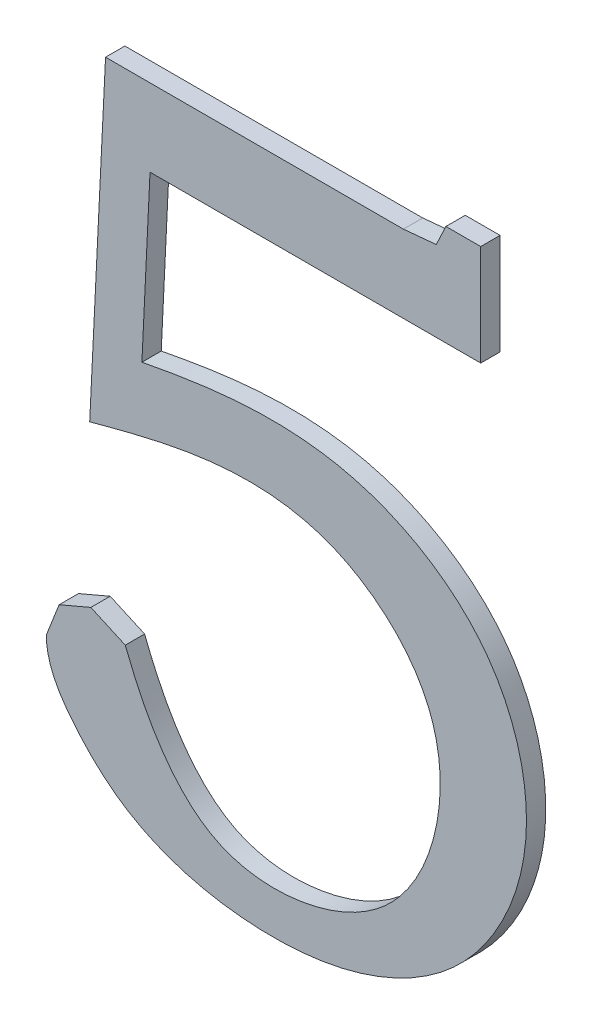
ISO-10303-21;
HEADER;
FILE_DESCRIPTION(('STEP AP214'),'2;1');
FILE_NAME('part.step','',(''),(''),'','','');
FILE_SCHEMA(('AUTOMOTIVE_DESIGN { 1 0 10303 214 1 1 1 1 }'));
ENDSEC;
DATA;
#1=APPLICATION_CONTEXT('core data for automotive mechanical design processes');
#2=APPLICATION_PROTOCOL_DEFINITION('international standard','automotive_design',2000,#1);
#3=PRODUCT_CONTEXT('',#1,'mechanical');
#4=PRODUCT('Part','Part','',(#3));
#5=PRODUCT_RELATED_PRODUCT_CATEGORY('part','',(#4));
#6=PRODUCT_DEFINITION_FORMATION('','',#4);
#7=PRODUCT_DEFINITION_CONTEXT('part definition',#1,'design');
#8=PRODUCT_DEFINITION('design','',#6,#7);
#9=PRODUCT_DEFINITION_SHAPE('','',#8);
#10=(LENGTH_UNIT() NAMED_UNIT(*) SI_UNIT(.MILLI.,.METRE.));
#11=(NAMED_UNIT(*) PLANE_ANGLE_UNIT() SI_UNIT($,.RADIAN.));
#12=(NAMED_UNIT(*) SI_UNIT($,.STERADIAN.) SOLID_ANGLE_UNIT());
#13=UNCERTAINTY_MEASURE_WITH_UNIT(LENGTH_MEASURE(1.E-05),#10,'distance_accuracy_value','');
#14=(GEOMETRIC_REPRESENTATION_CONTEXT(3) GLOBAL_UNCERTAINTY_ASSIGNED_CONTEXT((#13)) GLOBAL_UNIT_ASSIGNED_CONTEXT((#10,
#11,#12)) REPRESENTATION_CONTEXT('',''));
#15=CARTESIAN_POINT('',(0.,0.,0.));
#16=DIRECTION('',(0.,0.,1.));
#17=DIRECTION('',(1.,0.,0.));
#18=AXIS2_PLACEMENT_3D('',#15,#16,#17);
#19=CARTESIAN_POINT('',(0.,0.,0.05));
#20=DIRECTION('',(0.,0.,1.));
#21=DIRECTION('',(1.,0.,0.));
#22=AXIS2_PLACEMENT_3D('',#19,#20,#21);
#23=PLANE('',#22);
#24=CARTESIAN_POINT('',(0.215000000000006,-3.37500000000003,0.05));
#25=CARTESIAN_POINT('',(0.245903466585452,-3.36905711423566,0.05));
#26=CARTESIAN_POINT('',(0.276861083114359,-3.36342712276455,0.05));
#27=CARTESIAN_POINT('',(0.339083091608473,-3.3533354782567,0.05));
#28=CARTESIAN_POINT('',(0.370348202049942,-3.34887834210283,0.05));
#29=CARTESIAN_POINT('',(0.465470476616479,-3.33804916443584,0.05));
#30=CARTESIAN_POINT('',(0.529751407303073,-3.33442806677181,0.05));
#31=CARTESIAN_POINT('',(0.634715324383794,-3.33900187933727,0.05));
#32=CARTESIAN_POINT('',(0.675511591006974,-3.34339169712519,0.05));
#33=CARTESIAN_POINT('',(0.735689250542219,-3.3548825438947,0.05));
#34=CARTESIAN_POINT('',(0.755546621436471,-3.35951867413126,0.05));
#35=CARTESIAN_POINT('',(0.794779579926361,-3.3705221886248,0.05));
#36=CARTESIAN_POINT('',(0.814155156312189,-3.37688961312239,0.05));
#37=CARTESIAN_POINT('',(0.852467359147062,-3.39138186257519,0.05));
#38=CARTESIAN_POINT('',(0.871397467076891,-3.39952400005149,0.05));
#39=CARTESIAN_POINT('',(0.908432850529593,-3.41749609123042,0.05));
#40=CARTESIAN_POINT('',(0.926537950615481,-3.42732640182135,0.05));
#41=CARTESIAN_POINT('',(0.979317485429706,-3.45935943767655,0.05));
#42=CARTESIAN_POINT('',(1.0125199718965,-3.48412791484155,0.05));
#43=CARTESIAN_POINT('',(1.06383711617048,-3.53202986812759,0.05));
#44=CARTESIAN_POINT('',(1.08351556236493,-3.55349691589126,0.05));
#45=CARTESIAN_POINT('',(1.11877338084306,-3.59953766537733,0.05));
#46=CARTESIAN_POINT('',(1.13435983457692,-3.62410588970843,0.05));
#47=CARTESIAN_POINT('',(1.16116099954903,-3.67545159240918,0.05));
#48=CARTESIAN_POINT('',(1.17238163759565,-3.70222601545908,0.05));
#49=CARTESIAN_POINT('',(1.19048455769821,-3.75723968106191,0.05));
#50=CARTESIAN_POINT('',(1.19735935614138,-3.7854813602709,0.05));
#51=CARTESIAN_POINT('',(1.20691732778474,-3.84426334435704,0.05));
#52=CARTESIAN_POINT('',(1.20935222138211,-3.87484513124021,0.05));
#53=CARTESIAN_POINT('',(1.2092008571431,-3.92065927912881,0.05));
#54=CARTESIAN_POINT('',(1.20851688277896,-3.93591836571849,0.05));
#55=CARTESIAN_POINT('',(1.20585773827738,-3.96632366138515,0.05));
#56=CARTESIAN_POINT('',(1.20388260528059,-3.98146987369632,0.05));
#57=CARTESIAN_POINT('',(1.19602004152058,-4.02698791726087,0.05));
#58=CARTESIAN_POINT('',(1.18819771303669,-4.0570434459034,0.05));
#59=CARTESIAN_POINT('',(1.16790428540795,-4.11556737368617,0.05));
#60=CARTESIAN_POINT('',(1.15542541892041,-4.14403302911122,0.05));
#61=CARTESIAN_POINT('',(1.12541844922718,-4.20018817758872,0.05));
#62=CARTESIAN_POINT('',(1.10765230877395,-4.22775090461818,0.05));
#63=CARTESIAN_POINT('',(1.06782592688798,-4.27952756467753,0.05));
#64=CARTESIAN_POINT('',(1.04577292427871,-4.30374702688338,0.05));
#65=CARTESIAN_POINT('',(0.997645782698754,-4.34795149743017,0.05));
#66=CARTESIAN_POINT('',(0.971560186294016,-4.36792404283981,0.05));
#67=CARTESIAN_POINT('',(0.916466583641521,-4.4033301967737,0.05));
#68=CARTESIAN_POINT('',(0.887454813246492,-4.41875785629216,0.05));
#69=CARTESIAN_POINT('',(0.826896180832556,-4.44541857404922,0.05));
#70=CARTESIAN_POINT('',(0.795310566231487,-4.45656276795771,0.05));
#71=CARTESIAN_POINT('',(0.730921069599224,-4.47429890150065,0.05));
#72=CARTESIAN_POINT('',(0.698117667937941,-4.48089261643295,0.05));
#73=CARTESIAN_POINT('',(0.625564829208878,-4.49067059940833,0.05));
#74=CARTESIAN_POINT('',(0.585694208310927,-4.49295383712528,0.05));
#75=CARTESIAN_POINT('',(0.525915717618814,-4.4924108011374,0.05));
#76=CARTESIAN_POINT('',(0.505958273002295,-4.49156335758147,0.05));
#77=CARTESIAN_POINT('',(0.466144033970715,-4.48854671624867,0.05));
#78=CARTESIAN_POINT('',(0.446287221332685,-4.48637776707821,0.05));
#79=CARTESIAN_POINT('',(0.391645445935778,-4.47839643239916,0.05));
#80=CARTESIAN_POINT('',(0.357064848477889,-4.47106606377754,0.05));
#81=CARTESIAN_POINT('',(0.289561100597423,-4.4512342456699,0.05));
#82=CARTESIAN_POINT('',(0.256629385995813,-4.43876351442076,0.05));
#83=CARTESIAN_POINT('',(0.209182989478365,-4.41551997596485,0.05));
#84=CARTESIAN_POINT('',(0.193587485838812,-4.40693713391387,0.05));
#85=CARTESIAN_POINT('',(0.163405799646059,-4.38815929113625,0.05));
#86=CARTESIAN_POINT('',(0.148819073094776,-4.37796516921665,0.05));
#87=CARTESIAN_POINT('',(0.106711460343672,-4.34506143047575,0.05));
#88=CARTESIAN_POINT('',(0.0809480167147807,-4.32008141274925,0.05));
#89=CARTESIAN_POINT('',(0.0517702639148749,-4.28735015168786,0.05));
#90=CARTESIAN_POINT('',(0.0464288803680406,-4.28115151095174,0.05));
#91=CARTESIAN_POINT('',(0.0359612052448801,-4.2685761389865,0.05));
#92=CARTESIAN_POINT('',(0.0308348477583716,-4.26219946334206,0.05));
#93=CARTESIAN_POINT('',(0.0159536132241785,-4.2427198502194,0.05));
#94=CARTESIAN_POINT('',(0.00666776868684382,-4.22923648102013,0.05));
#95=CARTESIAN_POINT('',(-0.00743544372719811,-4.20472414513238,0.05));
#96=CARTESIAN_POINT('',(-0.0127832715877641,-4.1940071849183,0.05));
#97=CARTESIAN_POINT('',(-0.0217225935799708,-4.17188108609494,0.05));
#98=CARTESIAN_POINT('',(-0.0253209528200204,-4.160474853801,0.05));
#99=CARTESIAN_POINT('',(-0.0292292823414662,-4.14231449656517,0.05));
#100=CARTESIAN_POINT('',(-0.0302894160147364,-4.13571799643762,0.05));
#101=CARTESIAN_POINT('',(-0.0316949176221807,-4.12241561621906,0.05));
#102=CARTESIAN_POINT('',(-0.0320366078272705,-4.11570934958413,0.05));
#103=CARTESIAN_POINT('',(-0.0320000000000032,-4.109,0.05));
#104=B_SPLINE_CURVE_WITH_KNOTS('',3,(#24,#25,#26,#27,#28,#29,#30,#31,#32,#33,#34,#35,#36,#37,
#38,#39,#40,#41,#42,#43,#44,#45,#46,#47,#48,#49,#50,#51,#52,#53,#54,#55,#56,#57,#58,#59,#60,#61,
#62,#63,#64,#65,#66,#67,#68,#69,#70,#71,#72,#73,#74,#75,#76,#77,#78,#79,#80,#81,#82,#83,#84,#85,
#86,#87,#88,#89,#90,#91,#92,#93,#94,#95,#96,#97,#98,#99,#100,#101,#102,#103),.UNSPECIFIED.,.F.,
.F.,(4,2,2,2,2,2,2,2,2,2,2,2,2,2,2,2,2,2,2,2,2,2,2,2,2,2,2,2,2,2,2,2,2,2,2,2,2,2,2,4),(0.,
0.0943859908861195,0.189130328990095,0.38139247222954,0.504009278141294,0.565113466932535,
0.626219076094218,0.687949821319785,0.7496936328373,0.872980033116765,0.959960873291931,
1.04679018034974,1.133501197639,1.22036112896927,1.31194466120054,1.35772115704029,
1.40349633616052,1.49621874932082,1.58909652464235,1.68703410458372,1.78480772098125,
1.88286441889481,1.98104890308514,2.08117259630925,2.18125720573242,2.30061438591375,
2.36050872183691,2.42039179369839,2.52609973773613,2.63118493602313,2.68450238441268,
2.73779085268093,2.84470996019873,2.86926056779368,2.89380359426274,2.94276335293591,
2.97858798855532,3.01427088633788,3.03427782425831,3.05438693128631),.UNSPECIFIED.);
#105=CARTESIAN_POINT('',(0.215000000000003,-3.37500000000001,0.05));
#106=VERTEX_POINT('',#105);
#107=CARTESIAN_POINT('',(-0.0320000000000027,-4.109,0.05));
#108=VERTEX_POINT('',#107);
#109=EDGE_CURVE('E138',#106,#108,#104,.T.);
#110=ORIENTED_EDGE('',*,*,#109,.F.);
#111=DIRECTION('',(0.0481093659523195,0.998842074057589,0.));
#112=VECTOR('',#111,1.);
#113=CARTESIAN_POINT('',(0.215,-3.375,0.05));
#114=LINE('',#113,#112);
#115=CARTESIAN_POINT('',(0.236000000000001,-2.939,0.05));
#116=VERTEX_POINT('',#115);
#117=EDGE_CURVE('E134',#116,#106,#114,.F.);
#118=ORIENTED_EDGE('',*,*,#117,.F.);
#119=DIRECTION('',(1.,0.,0.));
#120=VECTOR('',#119,1.);
#121=CARTESIAN_POINT('',(0.236,-2.939,0.05));
#122=LINE('',#121,#120);
#123=CARTESIAN_POINT('',(1.091,-2.939,0.05));
#124=VERTEX_POINT('',#123);
#125=EDGE_CURVE('E125',#124,#116,#122,.F.);
#126=ORIENTED_EDGE('',*,*,#125,.F.);
#127=DIRECTION('',(0.,1.,0.));
#128=VECTOR('',#127,1.);
#129=CARTESIAN_POINT('',(1.091,-2.939,0.05));
#130=LINE('',#129,#128);
#131=CARTESIAN_POINT('',(1.091,-2.678,0.05));
#132=VERTEX_POINT('',#131);
#133=EDGE_CURVE('E120',#132,#124,#130,.F.);
#134=ORIENTED_EDGE('',*,*,#133,.F.);
#135=DIRECTION('',(1.,0.,0.));
#136=VECTOR('',#135,1.);
#137=CARTESIAN_POINT('',(1.091,-2.678,0.05));
#138=LINE('',#137,#136);
#139=CARTESIAN_POINT('',(1.001,-2.678,0.05));
#140=VERTEX_POINT('',#139);
#141=EDGE_CURVE('E192',#140,#132,#138,.T.);
#142=ORIENTED_EDGE('',*,*,#141,.F.);
#143=DIRECTION('',(-0.426618675713,-0.904431592511499,0.));
#144=VECTOR('',#143,1.);
#145=CARTESIAN_POINT('',(1.001,-2.678,0.05));
#146=LINE('',#145,#144);
#147=CARTESIAN_POINT('',(0.975999999999999,-2.731,0.05));
#148=VERTEX_POINT('',#147);
#149=EDGE_CURVE('E187',#148,#140,#146,.F.);
#150=ORIENTED_EDGE('',*,*,#149,.F.);
#151=DIRECTION('',(-0.995600143653054,-0.0937035429320457,0.));
#152=VECTOR('',#151,1.);
#153=CARTESIAN_POINT('',(0.976,-2.731,0.05));
#154=LINE('',#153,#152);
#155=CARTESIAN_POINT('',(0.891,-2.739,0.05));
#156=VERTEX_POINT('',#155);
#157=EDGE_CURVE('E182',#156,#148,#154,.F.);
#158=ORIENTED_EDGE('',*,*,#157,.F.);
#159=DIRECTION('',(1.,0.,0.));
#160=VECTOR('',#159,1.);
#161=CARTESIAN_POINT('',(0.891,-2.739,0.05));
#162=LINE('',#161,#160);
#163=CARTESIAN_POINT('',(0.121,-2.739,0.05));
#164=VERTEX_POINT('',#163);
#165=EDGE_CURVE('E177',#164,#156,#162,.T.);
#166=ORIENTED_EDGE('',*,*,#165,.F.);
#167=DIRECTION('',(-0.0489258053082686,-0.998802415683371,0.));
#168=VECTOR('',#167,1.);
#169=CARTESIAN_POINT('',(0.121,-2.739,0.05));
#170=LINE('',#169,#168);
#171=CARTESIAN_POINT('',(0.0800000000000766,-3.57600000000007,0.05));
#172=VERTEX_POINT('',#171);
#173=EDGE_CURVE('E85',#172,#164,#170,.F.);
#174=ORIENTED_EDGE('',*,*,#173,.F.);
#175=CARTESIAN_POINT('',(0.171999999999978,-4.03000000000001,0.05));
#176=CARTESIAN_POINT('',(0.178896140563134,-4.04780539737631,0.05));
#177=CARTESIAN_POINT('',(0.186137640591984,-4.06548990399688,0.05));
#178=CARTESIAN_POINT('',(0.2015331284076,-4.10054178904504,0.05));
#179=CARTESIAN_POINT('',(0.209690745116484,-4.11790756484758,0.05));
#180=CARTESIAN_POINT('',(0.22733810531845,-4.15259195056955,0.05));
#181=CARTESIAN_POINT('',(0.236859538699577,-4.16989468752788,0.05));
#182=CARTESIAN_POINT('',(0.257285010280156,-4.20363539004983,0.05));
#183=CARTESIAN_POINT('',(0.26818659644492,-4.22007481785754,0.05));
#184=CARTESIAN_POINT('',(0.291549403639671,-4.25153359712039,0.05));
#185=CARTESIAN_POINT('',(0.303991030744811,-4.26656722955919,0.05));
#186=CARTESIAN_POINT('',(0.330751764669495,-4.29471175985156,0.05));
#187=CARTESIAN_POINT('',(0.345057330021984,-4.30783520422788,0.05));
#188=CARTESIAN_POINT('',(0.373542676043754,-4.32968388515847,0.05));
#189=CARTESIAN_POINT('',(0.387438270478877,-4.33877118192846,0.05));
#190=CARTESIAN_POINT('',(0.416659863999298,-4.35426327649022,0.05));
#191=CARTESIAN_POINT('',(0.431985686746056,-4.36066840444432,0.05));
#192=CARTESIAN_POINT('',(0.463364939146916,-4.37084269852575,0.05));
#193=CARTESIAN_POINT('',(0.479413722406007,-4.37462668465626,0.05));
#194=CARTESIAN_POINT('',(0.511899337065392,-4.37993908424578,0.05));
#195=CARTESIAN_POINT('',(0.528337010335585,-4.38146204062518,0.05));
#196=CARTESIAN_POINT('',(0.569952124989109,-4.38277401732844,0.05));
#197=CARTESIAN_POINT('',(0.595178094646907,-4.38122935657052,0.05));
#198=CARTESIAN_POINT('',(0.632545628034522,-4.37589500087842,0.05));
#199=CARTESIAN_POINT('',(0.644934333232074,-4.37361041470583,0.05));
#200=CARTESIAN_POINT('',(0.669513723555951,-4.36806454866389,0.05));
#201=CARTESIAN_POINT('',(0.681704068623271,-4.36480174662241,0.05));
#202=CARTESIAN_POINT('',(0.718070108485009,-4.35343823644861,0.05));
#203=CARTESIAN_POINT('',(0.741787986848346,-4.34379748873107,0.05));
#204=CARTESIAN_POINT('',(0.787017359661076,-4.32028804977887,0.05));
#205=CARTESIAN_POINT('',(0.808533554713059,-4.30642862818653,0.05));
#206=CARTESIAN_POINT('',(0.837388150808704,-4.28327438499367,0.05));
#207=CARTESIAN_POINT('',(0.846060931690048,-4.2756103490105,0.05));
#208=CARTESIAN_POINT('',(0.862622653978975,-4.25948749613389,0.05));
#209=CARTESIAN_POINT('',(0.87051207417391,-4.25102917093604,0.05));
#210=CARTESIAN_POINT('',(0.893017786493315,-4.22461239242872,0.05));
#211=CARTESIAN_POINT('',(0.906447501372362,-4.20563183778653,0.05));
#212=CARTESIAN_POINT('',(0.932033328804713,-4.16261796853835,0.05));
#213=CARTESIAN_POINT('',(0.943638959148386,-4.13826265144212,0.05));
#214=CARTESIAN_POINT('',(0.962742228138601,-4.08796607059242,0.05));
#215=CARTESIAN_POINT('',(0.970232311267792,-4.06202198647118,0.05));
#216=CARTESIAN_POINT('',(0.981232121071886,-4.00894200621086,0.05));
#217=CARTESIAN_POINT('',(0.984687230501404,-3.98179480597043,0.05));
#218=CARTESIAN_POINT('',(0.987031875422131,-3.92733000458852,0.05));
#219=CARTESIAN_POINT('',(0.985932505690098,-3.90001297920805,0.05));
#220=CARTESIAN_POINT('',(0.97924959555953,-3.85188348100901,0.05));
#221=CARTESIAN_POINT('',(0.974681708831502,-3.8309360405272,0.05));
#222=CARTESIAN_POINT('',(0.965207550546341,-3.80035179458282,0.05));
#223=CARTESIAN_POINT('',(0.961614123081562,-3.79029983295013,0.05));
#224=CARTESIAN_POINT('',(0.953535062663151,-3.77056114343694,0.05));
#225=CARTESIAN_POINT('',(0.949049425402381,-3.76087441731986,0.05));
#226=CARTESIAN_POINT('',(0.934396965079837,-3.73250057206266,0.05));
#227=CARTESIAN_POINT('',(0.923013142215696,-3.71443196118228,0.05));
#228=CARTESIAN_POINT('',(0.897644257739893,-3.68019497488209,0.05));
#229=CARTESIAN_POINT('',(0.883652589109504,-3.66403160007622,0.05));
#230=CARTESIAN_POINT('',(0.852124654148241,-3.63229177012966,0.05));
#231=CARTESIAN_POINT('',(0.834375550393772,-3.61692733364754,0.05));
#232=CARTESIAN_POINT('',(0.79690151529236,-3.58887622756722,0.05));
#233=CARTESIAN_POINT('',(0.777178489960878,-3.57618701087641,0.05));
#234=CARTESIAN_POINT('',(0.744639552667024,-3.55837785911467,0.05));
#235=CARTESIAN_POINT('',(0.732340757591904,-3.55229794342447,0.05));
#236=CARTESIAN_POINT('',(0.707261021827039,-3.54123018841914,0.05));
#237=CARTESIAN_POINT('',(0.694480113249341,-3.53624227651914,0.05));
#238=CARTESIAN_POINT('',(0.655589673090792,-3.52295887197978,0.05));
#239=CARTESIAN_POINT('',(0.62890204799618,-3.5163271387691,0.05));
#240=CARTESIAN_POINT('',(0.563377008223649,-3.50505642528116,0.05));
#241=CARTESIAN_POINT('',(0.524207001091081,-3.50246989747851,0.05));
#242=CARTESIAN_POINT('',(0.445702095069033,-3.50318164962416,0.05));
#243=CARTESIAN_POINT('',(0.406368778252225,-3.50653191386098,0.05));
#244=CARTESIAN_POINT('',(0.318083071993669,-3.51854129923017,0.05));
#245=CARTESIAN_POINT('',(0.269310654087181,-3.52836142104796,0.05));
#246=CARTESIAN_POINT('',(0.173634274280811,-3.55083026862464,0.05));
#247=CARTESIAN_POINT('',(0.126713647413304,-3.56340486789167,0.05));
#248=CARTESIAN_POINT('',(0.0800000000001445,-3.57600000000006,0.05));
#249=B_SPLINE_CURVE_WITH_KNOTS('',3,(#175,#176,#177,#178,#179,#180,#181,#182,#183,#184,#185,
#186,#187,#188,#189,#190,#191,#192,#193,#194,#195,#196,#197,#198,#199,#200,#201,#202,#203,#204,
#205,#206,#207,#208,#209,#210,#211,#212,#213,#214,#215,#216,#217,#218,#219,#220,#221,#222,#223,
#224,#225,#226,#227,#228,#229,#230,#231,#232,#233,#234,#235,#236,#237,#238,#239,#240,#241,#242,
#243,#244,#245,#246,#247,#248),.UNSPECIFIED.,.F.,.F.,(4,2,2,2,2,2,2,2,2,2,2,2,2,2,2,2,2,2,2,2,2,
2,2,2,2,2,2,2,2,2,2,2,2,2,2,2,4),(0.,0.0572971549784898,0.114829863170725,0.174025583988104,
0.233117573628155,0.291522947347193,0.349525480432567,0.399093883340583,0.448656182816996,
0.497935916786132,0.54733439696244,0.622720405021426,0.660484522090849,0.698307710477397,
0.774710663007236,0.850946933482326,0.885620714924322,0.920273171706473,0.98966986040034,
1.07020616181848,1.15088982577728,1.23265340708102,1.31421792839036,1.37823392435822,
1.41022000909529,1.44220624824869,1.50596828986662,1.56989412530892,1.64007221137465,
1.71018317566792,1.75129639092013,1.79240687257051,1.87452547861674,1.99162703318268,
2.10975903560942,2.25884347504293,2.4043235358717),.UNSPECIFIED.);
#250=CARTESIAN_POINT('',(0.171999999999989,-4.03,0.05));
#251=VERTEX_POINT('',#250);
#252=EDGE_CURVE('E21',#251,#172,#249,.T.);
#253=ORIENTED_EDGE('',*,*,#252,.F.);
#254=DIRECTION('',(-0.912113164785765,0.409938501027284,0.));
#255=VECTOR('',#254,1.);
#256=CARTESIAN_POINT('',(0.172,-4.03,0.05));
#257=LINE('',#256,#255);
#258=CARTESIAN_POINT('',(0.0829999999999997,-3.99,0.05));
#259=VERTEX_POINT('',#258);
#260=EDGE_CURVE('E70',#259,#251,#257,.F.);
#261=ORIENTED_EDGE('',*,*,#260,.F.);
#262=DIRECTION('',(-0.919724178818037,-0.392565198276016,0.));
#263=VECTOR('',#262,1.);
#264=CARTESIAN_POINT('',(0.083,-3.99,0.05));
#265=LINE('',#264,#263);
#266=CARTESIAN_POINT('',(0.00100000000000022,-4.025,0.05));
#267=VERTEX_POINT('',#266);
#268=EDGE_CURVE('E163',#267,#259,#265,.F.);
#269=ORIENTED_EDGE('',*,*,#268,.F.);
#270=DIRECTION('',(-0.365652372423015,-0.930751493440339,0.));
#271=VECTOR('',#270,1.);
#272=CARTESIAN_POINT('',(0.001,-4.025,0.05));
#273=LINE('',#272,#271);
#274=EDGE_CURVE('E154',#108,#267,#273,.F.);
#275=ORIENTED_EDGE('',*,*,#274,.F.);
#276=EDGE_LOOP('',(#110,#118,#126,#134,#142,#150,#158,#166,#174,#253,#261,#269,#275));
#277=FACE_BOUND('',#276,.T.);
#278=ADVANCED_FACE('F17',(#277),#23,.T.);
#279=CARTESIAN_POINT('',(0.215,-3.375,0.));
#280=DIRECTION('',(0.998842074057589,-0.0481093659523195,0.));
#281=DIRECTION('',(0.0481093659523195,0.998842074057589,0.));
#282=AXIS2_PLACEMENT_3D('',#279,#280,#281);
#283=PLANE('',#282);
#284=DIRECTION('',(0.,0.,1.));
#285=VECTOR('',#284,1.);
#286=CARTESIAN_POINT('',(0.215000000000005,-3.37500000000003,0.));
#287=LINE('',#286,#285);
#288=CARTESIAN_POINT('',(0.215000000000003,-3.37500000000001,0.));
#289=VERTEX_POINT('',#288);
#290=EDGE_CURVE('E230',#289,#106,#287,.T.);
#291=ORIENTED_EDGE('',*,*,#290,.F.);
#292=DIRECTION('',(0.0481093659523151,0.998842074057589,0.));
#293=VECTOR('',#292,1.);
#294=CARTESIAN_POINT('',(0.215,-3.375,0.));
#295=LINE('',#294,#293);
#296=CARTESIAN_POINT('',(0.236,-2.939,0.));
#297=VERTEX_POINT('',#296);
#298=EDGE_CURVE('E145',#289,#297,#295,.T.);
#299=ORIENTED_EDGE('',*,*,#298,.T.);
#300=DIRECTION('',(0.,0.,-1.));
#301=VECTOR('',#300,1.);
#302=CARTESIAN_POINT('',(0.236,-2.939,0.));
#303=LINE('',#302,#301);
#304=EDGE_CURVE('E130',#116,#297,#303,.T.);
#305=ORIENTED_EDGE('',*,*,#304,.F.);
#306=ORIENTED_EDGE('',*,*,#117,.T.);
#307=EDGE_LOOP('',(#291,#299,#305,#306));
#308=FACE_BOUND('',#307,.T.);
#309=ADVANCED_FACE('F144',(#308),#283,.T.);
#310=CARTESIAN_POINT('',(0.236,-2.939,0.));
#311=DIRECTION('',(0.,-1.,0.));
#312=DIRECTION('',(0.,0.,-1.));
#313=AXIS2_PLACEMENT_3D('',#310,#311,#312);
#314=PLANE('',#313);
#315=ORIENTED_EDGE('',*,*,#304,.T.);
#316=DIRECTION('',(1.,0.,0.));
#317=VECTOR('',#316,1.);
#318=CARTESIAN_POINT('',(0.,-2.939,0.));
#319=LINE('',#318,#317);
#320=CARTESIAN_POINT('',(1.091,-2.939,0.));
#321=VERTEX_POINT('',#320);
#322=EDGE_CURVE('E318',#297,#321,#319,.T.);
#323=ORIENTED_EDGE('',*,*,#322,.T.);
#324=DIRECTION('',(0.,0.,-1.));
#325=VECTOR('',#324,1.);
#326=CARTESIAN_POINT('',(1.091,-2.939,0.));
#327=LINE('',#326,#325);
#328=EDGE_CURVE('E132',#124,#321,#327,.T.);
#329=ORIENTED_EDGE('',*,*,#328,.F.);
#330=ORIENTED_EDGE('',*,*,#125,.T.);
#331=EDGE_LOOP('',(#315,#323,#329,#330));
#332=FACE_BOUND('',#331,.T.);
#333=ADVANCED_FACE('F127',(#332),#314,.T.);
#334=CARTESIAN_POINT('',(1.091,-2.939,0.));
#335=DIRECTION('',(1.,0.,0.));
#336=DIRECTION('',(0.,0.,-1.));
#337=AXIS2_PLACEMENT_3D('',#334,#335,#336);
#338=PLANE('',#337);
#339=ORIENTED_EDGE('',*,*,#328,.T.);
#340=DIRECTION('',(0.,1.,0.));
#341=VECTOR('',#340,1.);
#342=CARTESIAN_POINT('',(1.091,0.,0.));
#343=LINE('',#342,#341);
#344=CARTESIAN_POINT('',(1.091,-2.678,0.));
#345=VERTEX_POINT('',#344);
#346=EDGE_CURVE('E319',#321,#345,#343,.T.);
#347=ORIENTED_EDGE('',*,*,#346,.T.);
#348=DIRECTION('',(0.,0.,1.));
#349=VECTOR('',#348,1.);
#350=CARTESIAN_POINT('',(1.091,-2.678,0.));
#351=LINE('',#350,#349);
#352=EDGE_CURVE('E189',#132,#345,#351,.F.);
#353=ORIENTED_EDGE('',*,*,#352,.F.);
#354=ORIENTED_EDGE('',*,*,#133,.T.);
#355=EDGE_LOOP('',(#339,#347,#353,#354));
#356=FACE_BOUND('',#355,.T.);
#357=ADVANCED_FACE('F279',(#356),#338,.T.);
#358=CARTESIAN_POINT('',(1.091,-2.678,0.));
#359=DIRECTION('',(0.,1.,0.));
#360=DIRECTION('',(0.,0.,1.));
#361=AXIS2_PLACEMENT_3D('',#358,#359,#360);
#362=PLANE('',#361);
#363=ORIENTED_EDGE('',*,*,#352,.T.);
#364=DIRECTION('',(1.,0.,0.));
#365=VECTOR('',#364,1.);
#366=CARTESIAN_POINT('',(0.,-2.678,0.));
#367=LINE('',#366,#365);
#368=CARTESIAN_POINT('',(1.001,-2.678,0.));
#369=VERTEX_POINT('',#368);
#370=EDGE_CURVE('E321',#345,#369,#367,.F.);
#371=ORIENTED_EDGE('',*,*,#370,.T.);
#372=DIRECTION('',(0.,0.,1.));
#373=VECTOR('',#372,1.);
#374=CARTESIAN_POINT('',(1.001,-2.678,0.));
#375=LINE('',#374,#373);
#376=EDGE_CURVE('E184',#140,#369,#375,.F.);
#377=ORIENTED_EDGE('',*,*,#376,.F.);
#378=ORIENTED_EDGE('',*,*,#141,.T.);
#379=EDGE_LOOP('',(#363,#371,#377,#378));
#380=FACE_BOUND('',#379,.T.);
#381=ADVANCED_FACE('F275',(#380),#362,.T.);
#382=CARTESIAN_POINT('',(1.001,-2.678,0.));
#383=DIRECTION('',(-0.904431592511499,0.426618675713,0.));
#384=DIRECTION('',(-0.426618675713,-0.904431592511499,0.));
#385=AXIS2_PLACEMENT_3D('',#382,#383,#384);
#386=PLANE('',#385);
#387=ORIENTED_EDGE('',*,*,#376,.T.);
#388=DIRECTION('',(-0.426618675712975,-0.904431592511511,0.));
#389=VECTOR('',#388,1.);
#390=CARTESIAN_POINT('',(1.001,-2.678,0.));
#391=LINE('',#390,#389);
#392=CARTESIAN_POINT('',(0.976,-2.731,0.));
#393=VERTEX_POINT('',#392);
#394=EDGE_CURVE('E336',#369,#393,#391,.T.);
#395=ORIENTED_EDGE('',*,*,#394,.T.);
#396=DIRECTION('',(0.,0.,1.));
#397=VECTOR('',#396,1.);
#398=CARTESIAN_POINT('',(0.976,-2.731,0.));
#399=LINE('',#398,#397);
#400=EDGE_CURVE('E179',#148,#393,#399,.F.);
#401=ORIENTED_EDGE('',*,*,#400,.F.);
#402=ORIENTED_EDGE('',*,*,#149,.T.);
#403=EDGE_LOOP('',(#387,#395,#401,#402));
#404=FACE_BOUND('',#403,.T.);
#405=ADVANCED_FACE('F271',(#404),#386,.T.);
#406=CARTESIAN_POINT('',(0.976,-2.731,0.));
#407=DIRECTION('',(-0.0937035429320457,0.995600143653054,0.));
#408=DIRECTION('',(-0.995600143653054,-0.0937035429320457,0.));
#409=AXIS2_PLACEMENT_3D('',#406,#407,#408);
#410=PLANE('',#409);
#411=ORIENTED_EDGE('',*,*,#400,.T.);
#412=DIRECTION('',(-0.995600143653053,-0.0937035429320545,0.));
#413=VECTOR('',#412,1.);
#414=CARTESIAN_POINT('',(0.976,-2.731,0.));
#415=LINE('',#414,#413);
#416=CARTESIAN_POINT('',(0.891,-2.739,0.));
#417=VERTEX_POINT('',#416);
#418=EDGE_CURVE('E344',#393,#417,#415,.T.);
#419=ORIENTED_EDGE('',*,*,#418,.T.);
#420=DIRECTION('',(0.,0.,1.));
#421=VECTOR('',#420,1.);
#422=CARTESIAN_POINT('',(0.891,-2.739,0.));
#423=LINE('',#422,#421);
#424=EDGE_CURVE('E174',#156,#417,#423,.F.);
#425=ORIENTED_EDGE('',*,*,#424,.F.);
#426=ORIENTED_EDGE('',*,*,#157,.T.);
#427=EDGE_LOOP('',(#411,#419,#425,#426));
#428=FACE_BOUND('',#427,.T.);
#429=ADVANCED_FACE('F267',(#428),#410,.T.);
#430=CARTESIAN_POINT('',(0.891,-2.739,0.));
#431=DIRECTION('',(0.,1.,0.));
#432=DIRECTION('',(0.,0.,1.));
#433=AXIS2_PLACEMENT_3D('',#430,#431,#432);
#434=PLANE('',#433);
#435=ORIENTED_EDGE('',*,*,#424,.T.);
#436=DIRECTION('',(1.,0.,0.));
#437=VECTOR('',#436,1.);
#438=CARTESIAN_POINT('',(0.,-2.739,0.));
#439=LINE('',#438,#437);
#440=CARTESIAN_POINT('',(0.121,-2.739,0.));
#441=VERTEX_POINT('',#440);
#442=EDGE_CURVE('E316',#417,#441,#439,.F.);
#443=ORIENTED_EDGE('',*,*,#442,.T.);
#444=DIRECTION('',(0.,0.,1.));
#445=VECTOR('',#444,1.);
#446=CARTESIAN_POINT('',(0.121,-2.739,0.));
#447=LINE('',#446,#445);
#448=EDGE_CURVE('E173',#164,#441,#447,.F.);
#449=ORIENTED_EDGE('',*,*,#448,.F.);
#450=ORIENTED_EDGE('',*,*,#165,.T.);
#451=EDGE_LOOP('',(#435,#443,#449,#450));
#452=FACE_BOUND('',#451,.T.);
#453=ADVANCED_FACE('F264',(#452),#434,.T.);
#454=CARTESIAN_POINT('',(0.121,-2.739,0.));
#455=DIRECTION('',(-0.998802415683371,0.0489258053082686,0.));
#456=DIRECTION('',(-0.0489258053082686,-0.998802415683371,0.));
#457=AXIS2_PLACEMENT_3D('',#454,#455,#456);
#458=PLANE('',#457);
#459=ORIENTED_EDGE('',*,*,#448,.T.);
#460=DIRECTION('',(-0.0489258053082655,-0.998802415683371,0.));
#461=VECTOR('',#460,1.);
#462=CARTESIAN_POINT('',(0.121,-2.739,0.));
#463=LINE('',#462,#461);
#464=CARTESIAN_POINT('',(0.0800000000000778,-3.57600000000007,0.));
#465=VERTEX_POINT('',#464);
#466=EDGE_CURVE('E308',#441,#465,#463,.T.);
#467=ORIENTED_EDGE('',*,*,#466,.T.);
#468=DIRECTION('',(0.,0.,1.));
#469=VECTOR('',#468,1.);
#470=CARTESIAN_POINT('',(0.0800000000000238,-3.57600000000009,0.));
#471=LINE('',#470,#469);
#472=EDGE_CURVE('E169',#172,#465,#471,.F.);
#473=ORIENTED_EDGE('',*,*,#472,.F.);
#474=ORIENTED_EDGE('',*,*,#173,.T.);
#475=EDGE_LOOP('',(#459,#467,#473,#474));
#476=FACE_BOUND('',#475,.T.);
#477=ADVANCED_FACE('F260',(#476),#458,.T.);
#478=CARTESIAN_POINT('',(0.05676846311122,-3.582238124013,0.));
#479=CARTESIAN_POINT('',(0.06443714949378,-3.580186029721,0.));
#480=CARTESIAN_POINT('',(0.1628160620811,-3.55373069966,0.));
#481=CARTESIAN_POINT('',(0.3846885271768,-3.493746334031,0.));
#482=CARTESIAN_POINT('',(0.7203687622395,-3.501628224371,0.));
#483=CARTESIAN_POINT('',(0.9748051501909,-3.727589148049,0.));
#484=CARTESIAN_POINT('',(1.001487106498,-4.028638411571,0.));
#485=CARTESIAN_POINT('',(0.890782717944,-4.274692646711,0.));
#486=CARTESIAN_POINT('',(0.6532785993848,-4.392137719886,0.));
#487=CARTESIAN_POINT('',(0.4052508352563,-4.384563012738,0.));
#488=CARTESIAN_POINT('',(0.2510695755037,-4.21392723943,0.));
#489=CARTESIAN_POINT('',(0.1892590978546,-4.075892389772,0.));
#490=CARTESIAN_POINT('',(0.1664407623083,-4.015459845091,0.));
#491=CARTESIAN_POINT('',(0.1638310331484,-4.008407377597,0.));
#492=(BOUNDED_CURVE() B_SPLINE_CURVE(3,(#478,#479,#480,#481,#482,#483,#484,#485,#486,#487,#488,
#489,#490,#491),.UNSPECIFIED.,.F.,.F.) B_SPLINE_CURVE_WITH_KNOTS((4,1,1,1,1,1,1,1,1,1,1,4),(0.,
0.0106490408348,0.1352557452631,0.2729932605305,0.4134390520072,0.5064977218879,0.6319816188337,
0.7187997275147,0.8226380574604,0.9110756999416,0.9893941730211,1.),
.UNSPECIFIED.) CURVE() GEOMETRIC_REPRESENTATION_ITEM() RATIONAL_B_SPLINE_CURVE((1.,1.,1.,1.,1.,
1.,1.,1.,1.,1.,1.,1.,1.,1.)) REPRESENTATION_ITEM(''));
#493=DIRECTION('',(0.,0.,1.));
#494=VECTOR('',#493,1.);
#495=SURFACE_OF_LINEAR_EXTRUSION('',#492,#494);
#496=ORIENTED_EDGE('',*,*,#472,.T.);
#497=CARTESIAN_POINT('',(0.0800000000001461,-3.57600000000006,0.));
#498=CARTESIAN_POINT('',(0.132385367854683,-3.56186358738971,0.));
#499=CARTESIAN_POINT('',(0.184957639158565,-3.54779397761517,0.));
#500=CARTESIAN_POINT('',(0.265225152171211,-3.52962450352348,0.));
#501=CARTESIAN_POINT('',(0.292597447148205,-3.52400193832031,0.));
#502=CARTESIAN_POINT('',(0.347612211242027,-3.51440105497294,0.));
#503=CARTESIAN_POINT('',(0.375254347750912,-3.51042092362711,0.));
#504=CARTESIAN_POINT('',(0.437447104103239,-3.50404316622163,0.));
#505=CARTESIAN_POINT('',(0.472067541740826,-3.50225241279018,0.));
#506=CARTESIAN_POINT('',(0.541014647746676,-3.50360508394586,0.));
#507=CARTESIAN_POINT('',(0.575341434530923,-3.50670884989815,0.));
#508=CARTESIAN_POINT('',(0.636453112326347,-3.51804145061,0.));
#509=CARTESIAN_POINT('',(0.663429901174528,-3.52518234317097,0.));
#510=CARTESIAN_POINT('',(0.715762452503282,-3.54412610236813,0.));
#511=CARTESIAN_POINT('',(0.741115421949883,-3.55593676354333,0.));
#512=CARTESIAN_POINT('',(0.78945905397147,-3.58364597232991,0.));
#513=CARTESIAN_POINT('',(0.812449514313716,-3.59954486949038,0.));
#514=CARTESIAN_POINT('',(0.855424183661762,-3.63503382372201,0.));
#515=CARTESIAN_POINT('',(0.875407872141888,-3.65462451858979,0.));
#516=CARTESIAN_POINT('',(0.907430713602492,-3.69254800337868,0.));
#517=CARTESIAN_POINT('',(0.920251628416064,-3.71021985214504,0.));
#518=CARTESIAN_POINT('',(0.942749183919451,-3.74741974401372,0.));
#519=CARTESIAN_POINT('',(0.952436201747481,-3.76694137848189,0.));
#520=CARTESIAN_POINT('',(0.96809037414685,-3.80745551795571,0.));
#521=CARTESIAN_POINT('',(0.97405138633781,-3.82845038858956,0.));
#522=CARTESIAN_POINT('',(0.982510721236102,-3.87115724086133,0.));
#523=CARTESIAN_POINT('',(0.984998846199747,-3.8928711435466,0.));
#524=CARTESIAN_POINT('',(0.987080894045968,-3.94255030949145,0.));
#525=CARTESIAN_POINT('',(0.985663907909859,-3.97055602524923,0.));
#526=CARTESIAN_POINT('',(0.978367034595497,-4.02600276074073,0.));
#527=CARTESIAN_POINT('',(0.972479189388207,-4.05344268381633,0.));
#528=CARTESIAN_POINT('',(0.956216687513779,-4.10725053344864,0.));
#529=CARTESIAN_POINT('',(0.945802041024354,-4.13360655885331,0.));
#530=CARTESIAN_POINT('',(0.920361411472204,-4.18393131145095,0.));
#531=CARTESIAN_POINT('',(0.90535251634508,-4.20790845629913,0.));
#532=CARTESIAN_POINT('',(0.87485418387848,-4.24675483217605,0.));
#533=CARTESIAN_POINT('',(0.86038092800811,-4.26241710139045,0.));
#534=CARTESIAN_POINT('',(0.828879381819642,-4.29090802079637,0.));
#535=CARTESIAN_POINT('',(0.811852456386734,-4.30373817569587,0.));
#536=CARTESIAN_POINT('',(0.776044124378447,-4.3264022954659,0.));
#537=CARTESIAN_POINT('',(0.757270965329034,-4.33624949480457,0.));
#538=CARTESIAN_POINT('',(0.718455025323899,-4.35307823487422,0.));
#539=CARTESIAN_POINT('',(0.698409892973287,-4.36005427862488,0.));
#540=CARTESIAN_POINT('',(0.654889158491341,-4.37199173426316,0.));
#541=CARTESIAN_POINT('',(0.631308548856701,-4.37656869335709,0.));
#542=CARTESIAN_POINT('',(0.583699379462783,-4.38201709026177,0.));
#543=CARTESIAN_POINT('',(0.559670907322955,-4.38288924539104,0.));
#544=CARTESIAN_POINT('',(0.517935149406418,-4.38062940540602,0.));
#545=CARTESIAN_POINT('',(0.500176621579684,-4.37846068095946,0.));
#546=CARTESIAN_POINT('',(0.46525070522443,-4.37136697504349,0.));
#547=CARTESIAN_POINT('',(0.448081249752814,-4.36645297015997,0.));
#548=CARTESIAN_POINT('',(0.423161541864786,-4.35675011466857,0.));
#549=CARTESIAN_POINT('',(0.414958556392814,-4.35310513373632,0.));
#550=CARTESIAN_POINT('',(0.398955402815699,-4.34501756625393,0.));
#551=CARTESIAN_POINT('',(0.39115523601149,-4.34057497712806,0.));
#552=CARTESIAN_POINT('',(0.368389965979782,-4.3261937432161,0.));
#553=CARTESIAN_POINT('',(0.354081544069038,-4.31521025874553,0.));
#554=CARTESIAN_POINT('',(0.321652659331199,-4.28630485386963,0.));
#555=CARTESIAN_POINT('',(0.304431362488061,-4.26739970707016,0.));
#556=CARTESIAN_POINT('',(0.272871913046205,-4.22722160402739,0.));
#557=CARTESIAN_POINT('',(0.258552364273582,-4.20593464838671,0.));
#558=CARTESIAN_POINT('',(0.230621889293928,-4.1593293332665,0.));
#559=CARTESIAN_POINT('',(0.217310834910149,-4.1338360572392,0.));
#560=CARTESIAN_POINT('',(0.193118045669999,-4.0822811450515,0.));
#561=CARTESIAN_POINT('',(0.182196070161475,-4.05623863484374,0.));
#562=CARTESIAN_POINT('',(0.171999999999978,-4.03000000000001,0.));
#563=B_SPLINE_CURVE_WITH_KNOTS('',3,(#497,#498,#499,#500,#501,#502,#503,#504,#505,#506,#507,
#508,#509,#510,#511,#512,#513,#514,#515,#516,#517,#518,#519,#520,#521,#522,#523,#524,#525,#526,
#527,#528,#529,#530,#531,#532,#533,#534,#535,#536,#537,#538,#539,#540,#541,#542,#543,#544,#545,
#546,#547,#548,#549,#550,#551,#552,#553,#554,#555,#556,#557,#558,#559,#560,#561,#562),
.UNSPECIFIED.,.F.,.F.,(4,2,2,2,2,2,2,2,2,2,2,2,2,2,2,2,2,2,2,2,2,2,2,2,2,2,2,2,2,2,2,2,4),(0.,
0.163005146996506,0.246815765824496,0.330533610904311,0.434291351412355,0.537212688326236,
0.620544152827058,0.704015301148087,0.787493588727049,0.870986311295286,0.936230278492649,
1.00125594073423,1.0663885180551,1.13171195037884,1.21540912106564,1.29925562108615,
1.3838583748176,1.46815020228708,1.53181701715197,1.59544992385594,1.65879623013547,
1.72226325836649,1.79405800879134,1.86583885779211,1.91933728330771,1.97262331883037,
1.99951290905463,2.02640258611548,2.08025015975535,2.15655687766722,2.23333833187186,
2.31949237866446,2.40405906892045),.UNSPECIFIED.);
#564=CARTESIAN_POINT('',(0.172,-4.03,0.));
#565=VERTEX_POINT('',#564);
#566=EDGE_CURVE('E205',#465,#565,#563,.T.);
#567=ORIENTED_EDGE('',*,*,#566,.T.);
#568=DIRECTION('',(0.,0.,1.));
#569=VECTOR('',#568,1.);
#570=CARTESIAN_POINT('',(0.172,-4.03,0.));
#571=LINE('',#570,#569);
#572=EDGE_CURVE('E165',#251,#565,#571,.F.);
#573=ORIENTED_EDGE('',*,*,#572,.F.);
#574=ORIENTED_EDGE('',*,*,#252,.T.);
#575=EDGE_LOOP('',(#496,#567,#573,#574));
#576=FACE_BOUND('',#575,.T.);
#577=ADVANCED_FACE('F254',(#576),#495,.T.);
#578=CARTESIAN_POINT('',(0.172,-4.03,0.));
#579=DIRECTION('',(0.409938501027284,0.912113164785765,0.));
#580=DIRECTION('',(-0.912113164785765,0.409938501027284,0.));
#581=AXIS2_PLACEMENT_3D('',#578,#579,#580);
#582=PLANE('',#581);
#583=ORIENTED_EDGE('',*,*,#572,.T.);
#584=DIRECTION('',(-0.912113164785755,0.409938501027307,0.));
#585=VECTOR('',#584,1.);
#586=CARTESIAN_POINT('',(0.172,-4.03,0.));
#587=LINE('',#586,#585);
#588=CARTESIAN_POINT('',(0.083,-3.99,0.));
#589=VERTEX_POINT('',#588);
#590=EDGE_CURVE('E238',#565,#589,#587,.T.);
#591=ORIENTED_EDGE('',*,*,#590,.T.);
#592=DIRECTION('',(0.,0.,1.));
#593=VECTOR('',#592,1.);
#594=CARTESIAN_POINT('',(0.083,-3.99,0.));
#595=LINE('',#594,#593);
#596=EDGE_CURVE('E158',#259,#589,#595,.F.);
#597=ORIENTED_EDGE('',*,*,#596,.F.);
#598=ORIENTED_EDGE('',*,*,#260,.T.);
#599=EDGE_LOOP('',(#583,#591,#597,#598));
#600=FACE_BOUND('',#599,.T.);
#601=ADVANCED_FACE('F259',(#600),#582,.T.);
#602=CARTESIAN_POINT('',(0.083,-3.99,0.));
#603=DIRECTION('',(-0.392565198276016,0.919724178818037,0.));
#604=DIRECTION('',(-0.919724178818037,-0.392565198276016,0.));
#605=AXIS2_PLACEMENT_3D('',#602,#603,#604);
#606=PLANE('',#605);
#607=ORIENTED_EDGE('',*,*,#596,.T.);
#608=DIRECTION('',(-0.919724178818045,-0.392565198275998,0.));
#609=VECTOR('',#608,1.);
#610=CARTESIAN_POINT('',(0.083,-3.99,0.));
#611=LINE('',#610,#609);
#612=CARTESIAN_POINT('',(0.00100000000000001,-4.025,0.));
#613=VERTEX_POINT('',#612);
#614=EDGE_CURVE('E235',#589,#613,#611,.T.);
#615=ORIENTED_EDGE('',*,*,#614,.T.);
#616=DIRECTION('',(0.,0.,1.));
#617=VECTOR('',#616,1.);
#618=CARTESIAN_POINT('',(0.001,-4.025,0.));
#619=LINE('',#618,#617);
#620=EDGE_CURVE('E157',#267,#613,#619,.F.);
#621=ORIENTED_EDGE('',*,*,#620,.F.);
#622=ORIENTED_EDGE('',*,*,#268,.T.);
#623=EDGE_LOOP('',(#607,#615,#621,#622));
#624=FACE_BOUND('',#623,.T.);
#625=ADVANCED_FACE('F302',(#624),#606,.T.);
#626=CARTESIAN_POINT('',(0.001,-4.025,0.));
#627=DIRECTION('',(-0.930751493440339,0.365652372423015,0.));
#628=DIRECTION('',(-0.365652372423015,-0.930751493440339,0.));
#629=AXIS2_PLACEMENT_3D('',#626,#627,#628);
#630=PLANE('',#629);
#631=ORIENTED_EDGE('',*,*,#620,.T.);
#632=DIRECTION('',(-0.365652372422997,-0.930751493440346,0.));
#633=VECTOR('',#632,1.);
#634=CARTESIAN_POINT('',(0.001,-4.025,0.));
#635=LINE('',#634,#633);
#636=CARTESIAN_POINT('',(-0.0320000000000023,-4.109,0.));
#637=VERTEX_POINT('',#636);
#638=EDGE_CURVE('E31',#613,#637,#635,.T.);
#639=ORIENTED_EDGE('',*,*,#638,.T.);
#640=DIRECTION('',(0.,0.,1.));
#641=VECTOR('',#640,1.);
#642=CARTESIAN_POINT('',(-0.0320000000000032,-4.109,0.));
#643=LINE('',#642,#641);
#644=EDGE_CURVE('E39',#108,#637,#643,.F.);
#645=ORIENTED_EDGE('',*,*,#644,.F.);
#646=ORIENTED_EDGE('',*,*,#274,.T.);
#647=EDGE_LOOP('',(#631,#639,#645,#646));
#648=FACE_BOUND('',#647,.T.);
#649=ADVANCED_FACE('F216',(#648),#630,.T.);
#650=CARTESIAN_POINT('',(-0.02935195624382,-4.078421983671,0.));
#651=CARTESIAN_POINT('',(-0.03110536027401,-4.088887768679,0.));
#652=CARTESIAN_POINT('',(-0.03426819080703,-4.126833608732,0.));
#653=CARTESIAN_POINT('',(-0.01769152003564,-4.198098909437,0.));
#654=CARTESIAN_POINT('',(0.05002108647662,-4.290993699877,0.));
#655=CARTESIAN_POINT('',(0.2048947392573,-4.441299713272,0.));
#656=CARTESIAN_POINT('',(0.4880014987174,-4.511498194522,0.));
#657=CARTESIAN_POINT('',(0.7934634188441,-4.474142774029,0.));
#658=CARTESIAN_POINT('',(1.079086273273,-4.31783840112,0.));
#659=CARTESIAN_POINT('',(1.257210000661,-3.977431156736,0.));
#660=CARTESIAN_POINT('',(1.149597217325,-3.552510905028,0.));
#661=CARTESIAN_POINT('',(0.8189987559926,-3.347614286814,0.));
#662=CARTESIAN_POINT('',(0.4937733319702,-3.326904368662,0.));
#663=CARTESIAN_POINT('',(0.2938673552649,-3.359530495412,0.));
#664=CARTESIAN_POINT('',(0.195099482926,-3.37886106386,0.));
#665=CARTESIAN_POINT('',(0.185216152536,-3.380818585309,0.));
#666=(BOUNDED_CURVE() B_SPLINE_CURVE(3,(#650,#651,#652,#653,#654,#655,#656,#657,#658,#659,#660,
#661,#662,#663,#664,#665),.UNSPECIFIED.,.F.,.F.) B_SPLINE_CURVE_WITH_KNOTS((4,1,1,1,1,1,1,1,1,1,
1,1,1,4),(0.,0.009212505462299,0.03431856397685,0.07123115744586,0.1186395839667,
0.2430836590234,0.3366263187685,0.4147397550141,0.5523560595443,0.6754961692822,0.8056736186605,
0.8999745823956,0.9899441853203,1.),
.UNSPECIFIED.) CURVE() GEOMETRIC_REPRESENTATION_ITEM() RATIONAL_B_SPLINE_CURVE((1.,1.,1.,1.,1.,
1.,1.,1.,1.,1.,1.,1.,1.,1.,1.,1.)) REPRESENTATION_ITEM(''));
#667=DIRECTION('',(0.,0.,1.));
#668=VECTOR('',#667,1.);
#669=SURFACE_OF_LINEAR_EXTRUSION('',#666,#668);
#670=ORIENTED_EDGE('',*,*,#644,.T.);
#671=CARTESIAN_POINT('',(-0.0320000000000032,-4.109,0.));
#672=CARTESIAN_POINT('',(-0.0320299548966645,-4.1148461732536,0.));
#673=CARTESIAN_POINT('',(-0.0317751727596983,-4.12069085274704,0.));
#674=CARTESIAN_POINT('',(-0.030712673383772,-4.13232018659317,0.));
#675=CARTESIAN_POINT('',(-0.0299058691194904,-4.13810492407065,0.));
#676=CARTESIAN_POINT('',(-0.0267325631382097,-4.15503703454001,0.));
#677=CARTESIAN_POINT('',(-0.0236124417868859,-4.16604748199019,0.));
#678=CARTESIAN_POINT('',(-0.0142370479718174,-4.19138376355567,0.));
#679=CARTESIAN_POINT('',(-0.00724917781323196,-4.2054304991826,0.));
#680=CARTESIAN_POINT('',(0.00476919292754752,-4.22564696223545,0.));
#681=CARTESIAN_POINT('',(0.00906629393117231,-4.23228602427824,0.));
#682=CARTESIAN_POINT('',(0.0180547846691696,-4.24529770460286,0.));
#683=CARTESIAN_POINT('',(0.022746315307257,-4.2516702264396,0.));
#684=CARTESIAN_POINT('',(0.0329289221208461,-4.26485011910266,0.));
#685=CARTESIAN_POINT('',(0.0384521032213056,-4.27163229946936,0.));
#686=CARTESIAN_POINT('',(0.0497295615119196,-4.28500234108895,0.));
#687=CARTESIAN_POINT('',(0.055483882375734,-4.29159016520663,0.));
#688=CARTESIAN_POINT('',(0.073112809521418,-4.31103183264141,0.));
#689=CARTESIAN_POINT('',(0.0853514590142031,-4.32356140735236,0.));
#690=CARTESIAN_POINT('',(0.110815025989226,-4.34741466121184,0.));
#691=CARTESIAN_POINT('',(0.124033091583567,-4.35874558005214,0.));
#692=CARTESIAN_POINT('',(0.151581906639264,-4.37994581576918,0.));
#693=CARTESIAN_POINT('',(0.165911629147333,-4.3898164577128,0.));
#694=CARTESIAN_POINT('',(0.19454399310489,-4.40742221045946,0.));
#695=CARTESIAN_POINT('',(0.208787222285197,-4.41525471764834,0.));
#696=CARTESIAN_POINT('',(0.237905300092023,-4.42965324833073,0.));
#697=CARTESIAN_POINT('',(0.25278056066666,-4.43621842985849,0.));
#698=CARTESIAN_POINT('',(0.298240701600581,-4.45415773822622,0.));
#699=CARTESIAN_POINT('',(0.329551082448591,-4.4637112462382,0.));
#700=CARTESIAN_POINT('',(0.407664078167934,-4.48202329433535,0.));
#701=CARTESIAN_POINT('',(0.454998348752448,-4.48841665596124,0.));
#702=CARTESIAN_POINT('',(0.550054353574737,-4.49387779731622,0.));
#703=CARTESIAN_POINT('',(0.597775984051152,-4.49294747808384,0.));
#704=CARTESIAN_POINT('',(0.684209467329354,-4.48350971013482,0.));
#705=CARTESIAN_POINT('',(0.723058474423709,-4.4763338289335,0.));
#706=CARTESIAN_POINT('',(0.798994356074369,-4.45567212852758,0.));
#707=CARTESIAN_POINT('',(0.836084681451372,-4.44219928162354,0.));
#708=CARTESIAN_POINT('',(0.901511430829154,-4.4115036989218,0.));
#709=CARTESIAN_POINT('',(0.930293211519213,-4.39524047399275,0.));
#710=CARTESIAN_POINT('',(0.971113409862483,-4.36742992813526,0.));
#711=CARTESIAN_POINT('',(0.984328724194325,-4.35758982800961,0.));
#712=CARTESIAN_POINT('',(1.00983177571244,-4.3367741476502,0.));
#713=CARTESIAN_POINT('',(1.02211950458128,-4.32579855723688,0.));
#714=CARTESIAN_POINT('',(1.05747009930583,-4.29128377108968,0.));
#715=CARTESIAN_POINT('',(1.07901969538522,-4.26615702158794,0.));
#716=CARTESIAN_POINT('',(1.11764860032335,-4.21270087419564,0.));
#717=CARTESIAN_POINT('',(1.13472027387524,-4.18436612257385,0.));
#718=CARTESIAN_POINT('',(1.17850978417695,-4.09581855484504,0.));
#719=CARTESIAN_POINT('',(1.19808683271578,-4.03177580219322,0.));
#720=CARTESIAN_POINT('',(1.21307392418838,-3.90193634236645,0.));
#721=CARTESIAN_POINT('',(1.2088954987027,-3.83618902798735,0.));
#722=CARTESIAN_POINT('',(1.18654165082598,-3.74301336253508,0.));
#723=CARTESIAN_POINT('',(1.17670972632243,-3.71333179324984,0.));
#724=CARTESIAN_POINT('',(1.15204685587991,-3.65614068202298,0.));
#725=CARTESIAN_POINT('',(1.1372297322543,-3.62862539121444,0.));
#726=CARTESIAN_POINT('',(1.10339770353059,-3.57801877408248,0.));
#727=CARTESIAN_POINT('',(1.08459016410409,-3.55478829484995,0.));
#728=CARTESIAN_POINT('',(1.04333584466109,-3.51175643165124,0.));
#729=CARTESIAN_POINT('',(1.02087938544863,-3.49196446590012,0.));
#730=CARTESIAN_POINT('',(0.967824821628596,-3.45177871889819,0.));
#731=CARTESIAN_POINT('',(0.936542194075711,-3.43229393764657,0.));
#732=CARTESIAN_POINT('',(0.871285537956189,-3.39871822813959,0.));
#733=CARTESIAN_POINT('',(0.837315815431287,-3.38461887299951,0.));
#734=CARTESIAN_POINT('',(0.78496938540077,-3.36759874492848,0.));
#735=CARTESIAN_POINT('',(0.767241189187744,-3.36260604256715,0.));
#736=CARTESIAN_POINT('',(0.731449408692877,-3.35400781702062,0.));
#737=CARTESIAN_POINT('',(0.713385794993396,-3.3504024161162,0.));
#738=CARTESIAN_POINT('',(0.658736111349948,-3.34149360927114,0.));
#739=CARTESIAN_POINT('',(0.621829093955635,-3.33814065611492,0.));
#740=CARTESIAN_POINT('',(0.522287541136197,-3.33472731604883,0.));
#741=CARTESIAN_POINT('',(0.459560537130021,-3.33856272009911,0.));
#742=CARTESIAN_POINT('',(0.366711074670785,-3.34937928285067,0.));
#743=CARTESIAN_POINT('',(0.336185639898002,-3.3537788370571,0.));
#744=CARTESIAN_POINT('',(0.275423520902636,-3.363688675883,0.));
#745=CARTESIAN_POINT('',(0.24518619621741,-3.36919496045721,0.));
#746=CARTESIAN_POINT('',(0.215000000001346,-3.37499999999977,0.));
#747=B_SPLINE_CURVE_WITH_KNOTS('',3,(#671,#672,#673,#674,#675,#676,#677,#678,#679,#680,#681,
#682,#683,#684,#685,#686,#687,#688,#689,#690,#691,#692,#693,#694,#695,#696,#697,#698,#699,#700,
#701,#702,#703,#704,#705,#706,#707,#708,#709,#710,#711,#712,#713,#714,#715,#716,#717,#718,#719,
#720,#721,#722,#723,#724,#725,#726,#727,#728,#729,#730,#731,#732,#733,#734,#735,#736,#737,#738,
#739,#740,#741,#742,#743,#744,#745,#746),.UNSPECIFIED.,.F.,.F.,(4,2,2,2,2,2,2,2,2,2,2,2,2,2,2,2,
2,2,2,2,2,2,2,2,2,2,2,2,2,2,2,2,2,2,2,2,2,4),(0.,0.0175266550281863,0.0350243930341673,
0.0691781935645325,0.115958017232862,0.139675502343156,0.16340149644537,0.189634211062173,
0.215871905861254,0.268356647557759,0.320503720590539,0.372603180834385,0.421298359654719,
0.470025779296904,0.567855347889708,0.710461141162337,0.853029918872736,0.971062809338739,
1.08885360630938,1.18758483629903,1.23695586762147,1.28632734158895,1.38507271462538,
1.48398537972833,1.68065161733919,1.87392137623857,1.96737404822912,2.06056971334155,
2.14976709247935,2.23920506131764,2.34921820756476,2.45905849776525,2.51426339492951,
2.56947315689974,2.68032170844435,2.86804121059633,2.96056504253537,3.05276029278014),.UNSPECIFIED.);
#748=EDGE_CURVE('E11',#637,#289,#747,.T.);
#749=ORIENTED_EDGE('',*,*,#748,.T.);
#750=ORIENTED_EDGE('',*,*,#290,.T.);
#751=ORIENTED_EDGE('',*,*,#109,.T.);
#752=EDGE_LOOP('',(#670,#749,#750,#751));
#753=FACE_BOUND('',#752,.T.);
#754=ADVANCED_FACE('F211',(#753),#669,.T.);
#755=CARTESIAN_POINT('',(0.,0.,0.));
#756=DIRECTION('',(0.,0.,1.));
#757=DIRECTION('',(1.,0.,0.));
#758=AXIS2_PLACEMENT_3D('',#755,#756,#757);
#759=PLANE('',#758);
#760=ORIENTED_EDGE('',*,*,#638,.F.);
#761=ORIENTED_EDGE('',*,*,#614,.F.);
#762=ORIENTED_EDGE('',*,*,#590,.F.);
#763=ORIENTED_EDGE('',*,*,#566,.F.);
#764=ORIENTED_EDGE('',*,*,#466,.F.);
#765=ORIENTED_EDGE('',*,*,#442,.F.);
#766=ORIENTED_EDGE('',*,*,#418,.F.);
#767=ORIENTED_EDGE('',*,*,#394,.F.);
#768=ORIENTED_EDGE('',*,*,#370,.F.);
#769=ORIENTED_EDGE('',*,*,#346,.F.);
#770=ORIENTED_EDGE('',*,*,#322,.F.);
#771=ORIENTED_EDGE('',*,*,#298,.F.);
#772=ORIENTED_EDGE('',*,*,#748,.F.);
#773=EDGE_LOOP('',(#760,#761,#762,#763,#764,#765,#766,#767,#768,#769,#770,#771,#772));
#774=FACE_BOUND('',#773,.T.);
#775=ADVANCED_FACE('F209',(#774),#759,.F.);
#776=CLOSED_SHELL('',(#278,#309,#333,#357,#381,#405,#429,#453,#477,#577,#601,#625,#649,#754,#775));
#777=MANIFOLD_SOLID_BREP('B1',#776);
#778=ADVANCED_BREP_SHAPE_REPRESENTATION('',(#18,#777),#14);
#779=SHAPE_DEFINITION_REPRESENTATION(#9,#778);
ENDSEC;
END-ISO-10303-21;
